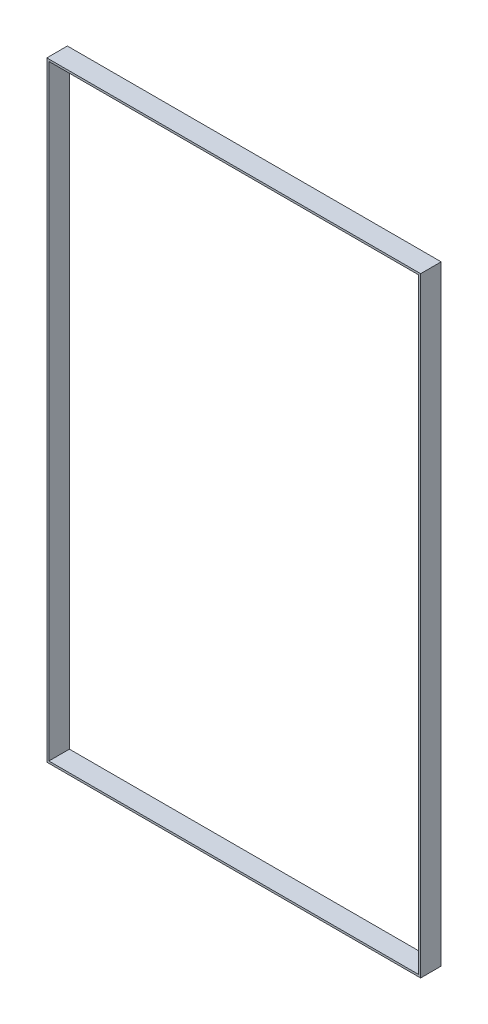
ISO-10303-21;
HEADER;
FILE_DESCRIPTION(('STEP AP214'),'2;1');
FILE_NAME('part.step','',(''),(''),'','','');
FILE_SCHEMA(('AUTOMOTIVE_DESIGN { 1 0 10303 214 1 1 1 1 }'));
ENDSEC;
DATA;
#1=APPLICATION_CONTEXT('core data for automotive mechanical design processes');
#2=APPLICATION_PROTOCOL_DEFINITION('international standard','automotive_design',2000,#1);
#3=PRODUCT_CONTEXT('',#1,'mechanical');
#4=PRODUCT('Part','Part','',(#3));
#5=PRODUCT_RELATED_PRODUCT_CATEGORY('part','',(#4));
#6=PRODUCT_DEFINITION_FORMATION('','',#4);
#7=PRODUCT_DEFINITION_CONTEXT('part definition',#1,'design');
#8=PRODUCT_DEFINITION('design','',#6,#7);
#9=PRODUCT_DEFINITION_SHAPE('','',#8);
#10=(LENGTH_UNIT() NAMED_UNIT(*) SI_UNIT(.MILLI.,.METRE.));
#11=(NAMED_UNIT(*) PLANE_ANGLE_UNIT() SI_UNIT($,.RADIAN.));
#12=(NAMED_UNIT(*) SI_UNIT($,.STERADIAN.) SOLID_ANGLE_UNIT());
#13=UNCERTAINTY_MEASURE_WITH_UNIT(LENGTH_MEASURE(1.E-05),#10,'distance_accuracy_value','');
#14=(GEOMETRIC_REPRESENTATION_CONTEXT(3) GLOBAL_UNCERTAINTY_ASSIGNED_CONTEXT((#13)) GLOBAL_UNIT_ASSIGNED_CONTEXT((#10,
#11,#12)) REPRESENTATION_CONTEXT('',''));
#15=CARTESIAN_POINT('',(0.,0.,0.));
#16=DIRECTION('',(0.,0.,1.));
#17=DIRECTION('',(1.,0.,0.));
#18=AXIS2_PLACEMENT_3D('',#15,#16,#17);
#19=CARTESIAN_POINT('',(91.,148.5,10.));
#20=DIRECTION('',(0.,0.,-1.));
#21=DIRECTION('',(-1.,0.,0.));
#22=AXIS2_PLACEMENT_3D('',#19,#20,#21);
#23=PLANE('',#22);
#24=DIRECTION('',(0.,1.,0.));
#25=VECTOR('',#24,1.);
#26=CARTESIAN_POINT('',(91.,-148.5,10.));
#27=LINE('',#26,#25);
#28=CARTESIAN_POINT('',(91.,-148.5,10.));
#29=VERTEX_POINT('',#28);
#30=CARTESIAN_POINT('',(91.,148.5,10.));
#31=VERTEX_POINT('',#30);
#32=EDGE_CURVE('E134',#29,#31,#27,.T.);
#33=ORIENTED_EDGE('',*,*,#32,.T.);
#34=DIRECTION('',(-1.,0.,0.));
#35=VECTOR('',#34,1.);
#36=CARTESIAN_POINT('',(-91.,148.5,10.));
#37=LINE('',#36,#35);
#38=CARTESIAN_POINT('',(-91.,148.5,10.));
#39=VERTEX_POINT('',#38);
#40=EDGE_CURVE('E137',#31,#39,#37,.T.);
#41=ORIENTED_EDGE('',*,*,#40,.T.);
#42=DIRECTION('',(0.,-1.,0.));
#43=VECTOR('',#42,1.);
#44=CARTESIAN_POINT('',(-91.,-148.5,10.));
#45=LINE('',#44,#43);
#46=CARTESIAN_POINT('',(-91.,-148.5,10.));
#47=VERTEX_POINT('',#46);
#48=EDGE_CURVE('E140',#39,#47,#45,.T.);
#49=ORIENTED_EDGE('',*,*,#48,.T.);
#50=DIRECTION('',(1.,0.,0.));
#51=VECTOR('',#50,1.);
#52=CARTESIAN_POINT('',(-91.,-148.5,10.));
#53=LINE('',#52,#51);
#54=EDGE_CURVE('E142',#47,#29,#53,.T.);
#55=ORIENTED_EDGE('',*,*,#54,.T.);
#56=EDGE_LOOP('',(#33,#41,#49,#55));
#57=FACE_BOUND('',#56,.T.);
#58=DIRECTION('',(0.,1.,0.));
#59=VECTOR('',#58,1.);
#60=CARTESIAN_POINT('',(90.,-147.5,10.));
#61=LINE('',#60,#59);
#62=CARTESIAN_POINT('',(90.,-147.5,10.));
#63=VERTEX_POINT('',#62);
#64=CARTESIAN_POINT('',(90.,147.5,10.));
#65=VERTEX_POINT('',#64);
#66=EDGE_CURVE('E98',#63,#65,#61,.T.);
#67=ORIENTED_EDGE('',*,*,#66,.F.);
#68=DIRECTION('',(1.,0.,0.));
#69=VECTOR('',#68,1.);
#70=CARTESIAN_POINT('',(-90.,-147.5,10.));
#71=LINE('',#70,#69);
#72=CARTESIAN_POINT('',(-90.,-147.5,10.));
#73=VERTEX_POINT('',#72);
#74=EDGE_CURVE('E120',#73,#63,#71,.T.);
#75=ORIENTED_EDGE('',*,*,#74,.F.);
#76=DIRECTION('',(0.,-1.,0.));
#77=VECTOR('',#76,1.);
#78=CARTESIAN_POINT('',(-90.,-147.5,10.));
#79=LINE('',#78,#77);
#80=CARTESIAN_POINT('',(-90.,147.5,10.));
#81=VERTEX_POINT('',#80);
#82=EDGE_CURVE('E118',#81,#73,#79,.T.);
#83=ORIENTED_EDGE('',*,*,#82,.F.);
#84=DIRECTION('',(-1.,0.,0.));
#85=VECTOR('',#84,1.);
#86=CARTESIAN_POINT('',(-90.,147.5,10.));
#87=LINE('',#86,#85);
#88=EDGE_CURVE('E106',#65,#81,#87,.T.);
#89=ORIENTED_EDGE('',*,*,#88,.F.);
#90=EDGE_LOOP('',(#67,#75,#83,#89));
#91=FACE_BOUND('',#90,.T.);
#92=ADVANCED_FACE('F33',(#57,#91),#23,.F.);
#93=CARTESIAN_POINT('',(91.,148.5,0.));
#94=DIRECTION('',(0.,0.,-1.));
#95=DIRECTION('',(-1.,0.,0.));
#96=AXIS2_PLACEMENT_3D('',#93,#94,#95);
#97=PLANE('',#96);
#98=DIRECTION('',(0.,1.,0.));
#99=VECTOR('',#98,1.);
#100=CARTESIAN_POINT('',(91.,-148.5,0.));
#101=LINE('',#100,#99);
#102=CARTESIAN_POINT('',(91.,-148.5,0.));
#103=VERTEX_POINT('',#102);
#104=CARTESIAN_POINT('',(91.,148.5,0.));
#105=VERTEX_POINT('',#104);
#106=EDGE_CURVE('E114',#103,#105,#101,.T.);
#107=ORIENTED_EDGE('',*,*,#106,.F.);
#108=DIRECTION('',(1.,0.,0.));
#109=VECTOR('',#108,1.);
#110=CARTESIAN_POINT('',(-91.,-148.5,0.));
#111=LINE('',#110,#109);
#112=CARTESIAN_POINT('',(-91.,-148.5,0.));
#113=VERTEX_POINT('',#112);
#114=EDGE_CURVE('E138',#113,#103,#111,.T.);
#115=ORIENTED_EDGE('',*,*,#114,.F.);
#116=DIRECTION('',(0.,-1.,0.));
#117=VECTOR('',#116,1.);
#118=CARTESIAN_POINT('',(-91.,-148.5,0.));
#119=LINE('',#118,#117);
#120=CARTESIAN_POINT('',(-91.,148.5,0.));
#121=VERTEX_POINT('',#120);
#122=EDGE_CURVE('E149',#121,#113,#119,.T.);
#123=ORIENTED_EDGE('',*,*,#122,.F.);
#124=DIRECTION('',(-1.,0.,0.));
#125=VECTOR('',#124,1.);
#126=CARTESIAN_POINT('',(-91.,148.5,0.));
#127=LINE('',#126,#125);
#128=EDGE_CURVE('E147',#105,#121,#127,.T.);
#129=ORIENTED_EDGE('',*,*,#128,.F.);
#130=EDGE_LOOP('',(#107,#115,#123,#129));
#131=FACE_BOUND('',#130,.T.);
#132=DIRECTION('',(1.,0.,0.));
#133=VECTOR('',#132,1.);
#134=CARTESIAN_POINT('',(-90.,-147.5,0.));
#135=LINE('',#134,#133);
#136=CARTESIAN_POINT('',(-90.,-147.5,0.));
#137=VERTEX_POINT('',#136);
#138=CARTESIAN_POINT('',(90.,-147.5,0.));
#139=VERTEX_POINT('',#138);
#140=EDGE_CURVE('E107',#137,#139,#135,.T.);
#141=ORIENTED_EDGE('',*,*,#140,.T.);
#142=DIRECTION('',(0.,1.,0.));
#143=VECTOR('',#142,1.);
#144=CARTESIAN_POINT('',(90.,-147.5,0.));
#145=LINE('',#144,#143);
#146=CARTESIAN_POINT('',(90.,147.5,0.));
#147=VERTEX_POINT('',#146);
#148=EDGE_CURVE('E56',#139,#147,#145,.T.);
#149=ORIENTED_EDGE('',*,*,#148,.T.);
#150=DIRECTION('',(-1.,0.,0.));
#151=VECTOR('',#150,1.);
#152=CARTESIAN_POINT('',(-90.,147.5,0.));
#153=LINE('',#152,#151);
#154=CARTESIAN_POINT('',(-90.,147.5,0.));
#155=VERTEX_POINT('',#154);
#156=EDGE_CURVE('E113',#147,#155,#153,.T.);
#157=ORIENTED_EDGE('',*,*,#156,.T.);
#158=DIRECTION('',(0.,-1.,0.));
#159=VECTOR('',#158,1.);
#160=CARTESIAN_POINT('',(-90.,-147.5,0.));
#161=LINE('',#160,#159);
#162=EDGE_CURVE('E126',#155,#137,#161,.T.);
#163=ORIENTED_EDGE('',*,*,#162,.T.);
#164=EDGE_LOOP('',(#141,#149,#157,#163));
#165=FACE_BOUND('',#164,.T.);
#166=ADVANCED_FACE('F167',(#131,#165),#97,.T.);
#167=CARTESIAN_POINT('',(91.,-148.5,10.));
#168=DIRECTION('',(-1.,0.,0.));
#169=DIRECTION('',(0.,0.,1.));
#170=AXIS2_PLACEMENT_3D('',#167,#168,#169);
#171=PLANE('',#170);
#172=ORIENTED_EDGE('',*,*,#106,.T.);
#173=DIRECTION('',(0.,0.,-1.));
#174=VECTOR('',#173,1.);
#175=CARTESIAN_POINT('',(91.,148.5,10.));
#176=LINE('',#175,#174);
#177=EDGE_CURVE('E11',#31,#105,#176,.T.);
#178=ORIENTED_EDGE('',*,*,#177,.F.);
#179=ORIENTED_EDGE('',*,*,#32,.F.);
#180=DIRECTION('',(0.,0.,-1.));
#181=VECTOR('',#180,1.);
#182=CARTESIAN_POINT('',(91.,-148.5,10.));
#183=LINE('',#182,#181);
#184=EDGE_CURVE('E144',#29,#103,#183,.T.);
#185=ORIENTED_EDGE('',*,*,#184,.T.);
#186=EDGE_LOOP('',(#172,#178,#179,#185));
#187=FACE_BOUND('',#186,.T.);
#188=ADVANCED_FACE('F35',(#187),#171,.F.);
#189=CARTESIAN_POINT('',(-91.,148.5,10.));
#190=DIRECTION('',(0.,-1.,0.));
#191=DIRECTION('',(0.,0.,-1.));
#192=AXIS2_PLACEMENT_3D('',#189,#190,#191);
#193=PLANE('',#192);
#194=ORIENTED_EDGE('',*,*,#128,.T.);
#195=DIRECTION('',(0.,0.,-1.));
#196=VECTOR('',#195,1.);
#197=CARTESIAN_POINT('',(-91.,148.5,10.));
#198=LINE('',#197,#196);
#199=EDGE_CURVE('E41',#39,#121,#198,.T.);
#200=ORIENTED_EDGE('',*,*,#199,.F.);
#201=ORIENTED_EDGE('',*,*,#40,.F.);
#202=ORIENTED_EDGE('',*,*,#177,.T.);
#203=EDGE_LOOP('',(#194,#200,#201,#202));
#204=FACE_BOUND('',#203,.T.);
#205=ADVANCED_FACE('F177',(#204),#193,.F.);
#206=CARTESIAN_POINT('',(-91.,-148.5,10.));
#207=DIRECTION('',(1.,0.,0.));
#208=DIRECTION('',(0.,0.,-1.));
#209=AXIS2_PLACEMENT_3D('',#206,#207,#208);
#210=PLANE('',#209);
#211=ORIENTED_EDGE('',*,*,#122,.T.);
#212=DIRECTION('',(0.,0.,-1.));
#213=VECTOR('',#212,1.);
#214=CARTESIAN_POINT('',(-91.,-148.5,10.));
#215=LINE('',#214,#213);
#216=EDGE_CURVE('E154',#47,#113,#215,.T.);
#217=ORIENTED_EDGE('',*,*,#216,.F.);
#218=ORIENTED_EDGE('',*,*,#48,.F.);
#219=ORIENTED_EDGE('',*,*,#199,.T.);
#220=EDGE_LOOP('',(#211,#217,#218,#219));
#221=FACE_BOUND('',#220,.T.);
#222=ADVANCED_FACE('F161',(#221),#210,.F.);
#223=CARTESIAN_POINT('',(-91.,-148.5,10.));
#224=DIRECTION('',(0.,1.,0.));
#225=DIRECTION('',(0.,0.,1.));
#226=AXIS2_PLACEMENT_3D('',#223,#224,#225);
#227=PLANE('',#226);
#228=ORIENTED_EDGE('',*,*,#114,.T.);
#229=ORIENTED_EDGE('',*,*,#184,.F.);
#230=ORIENTED_EDGE('',*,*,#54,.F.);
#231=ORIENTED_EDGE('',*,*,#216,.T.);
#232=EDGE_LOOP('',(#228,#229,#230,#231));
#233=FACE_BOUND('',#232,.T.);
#234=ADVANCED_FACE('F171',(#233),#227,.F.);
#235=CARTESIAN_POINT('',(90.,-147.5,10.));
#236=DIRECTION('',(-1.,0.,0.));
#237=DIRECTION('',(0.,0.,1.));
#238=AXIS2_PLACEMENT_3D('',#235,#236,#237);
#239=PLANE('',#238);
#240=ORIENTED_EDGE('',*,*,#148,.F.);
#241=DIRECTION('',(0.,0.,-1.));
#242=VECTOR('',#241,1.);
#243=CARTESIAN_POINT('',(90.,-147.5,10.));
#244=LINE('',#243,#242);
#245=EDGE_CURVE('E102',#63,#139,#244,.T.);
#246=ORIENTED_EDGE('',*,*,#245,.F.);
#247=ORIENTED_EDGE('',*,*,#66,.T.);
#248=DIRECTION('',(0.,0.,-1.));
#249=VECTOR('',#248,1.);
#250=CARTESIAN_POINT('',(90.,147.5,10.));
#251=LINE('',#250,#249);
#252=EDGE_CURVE('E101',#65,#147,#251,.T.);
#253=ORIENTED_EDGE('',*,*,#252,.T.);
#254=EDGE_LOOP('',(#240,#246,#247,#253));
#255=FACE_BOUND('',#254,.T.);
#256=ADVANCED_FACE('F100',(#255),#239,.T.);
#257=CARTESIAN_POINT('',(-90.,147.5,10.));
#258=DIRECTION('',(0.,-1.,0.));
#259=DIRECTION('',(0.,0.,-1.));
#260=AXIS2_PLACEMENT_3D('',#257,#258,#259);
#261=PLANE('',#260);
#262=ORIENTED_EDGE('',*,*,#156,.F.);
#263=ORIENTED_EDGE('',*,*,#252,.F.);
#264=ORIENTED_EDGE('',*,*,#88,.T.);
#265=DIRECTION('',(0.,0.,-1.));
#266=VECTOR('',#265,1.);
#267=CARTESIAN_POINT('',(-90.,147.5,10.));
#268=LINE('',#267,#266);
#269=EDGE_CURVE('E115',#81,#155,#268,.T.);
#270=ORIENTED_EDGE('',*,*,#269,.T.);
#271=EDGE_LOOP('',(#262,#263,#264,#270));
#272=FACE_BOUND('',#271,.T.);
#273=ADVANCED_FACE('F110',(#272),#261,.T.);
#274=CARTESIAN_POINT('',(-90.,-147.5,10.));
#275=DIRECTION('',(1.,0.,0.));
#276=DIRECTION('',(0.,0.,-1.));
#277=AXIS2_PLACEMENT_3D('',#274,#275,#276);
#278=PLANE('',#277);
#279=ORIENTED_EDGE('',*,*,#162,.F.);
#280=ORIENTED_EDGE('',*,*,#269,.F.);
#281=ORIENTED_EDGE('',*,*,#82,.T.);
#282=DIRECTION('',(0.,0.,-1.));
#283=VECTOR('',#282,1.);
#284=CARTESIAN_POINT('',(-90.,-147.5,10.));
#285=LINE('',#284,#283);
#286=EDGE_CURVE('E48',#73,#137,#285,.T.);
#287=ORIENTED_EDGE('',*,*,#286,.T.);
#288=EDGE_LOOP('',(#279,#280,#281,#287));
#289=FACE_BOUND('',#288,.T.);
#290=ADVANCED_FACE('F200',(#289),#278,.T.);
#291=CARTESIAN_POINT('',(-90.,-147.5,10.));
#292=DIRECTION('',(0.,1.,0.));
#293=DIRECTION('',(0.,0.,1.));
#294=AXIS2_PLACEMENT_3D('',#291,#292,#293);
#295=PLANE('',#294);
#296=ORIENTED_EDGE('',*,*,#140,.F.);
#297=ORIENTED_EDGE('',*,*,#286,.F.);
#298=ORIENTED_EDGE('',*,*,#74,.T.);
#299=ORIENTED_EDGE('',*,*,#245,.T.);
#300=EDGE_LOOP('',(#296,#297,#298,#299));
#301=FACE_BOUND('',#300,.T.);
#302=ADVANCED_FACE('F204',(#301),#295,.T.);
#303=CLOSED_SHELL('',(#92,#166,#188,#205,#222,#234,#256,#273,#290,#302));
#304=MANIFOLD_SOLID_BREP('B2',#303);
#305=ADVANCED_BREP_SHAPE_REPRESENTATION('',(#18,#304),#14);
#306=SHAPE_DEFINITION_REPRESENTATION(#9,#305);
ENDSEC;
END-ISO-10303-21;
